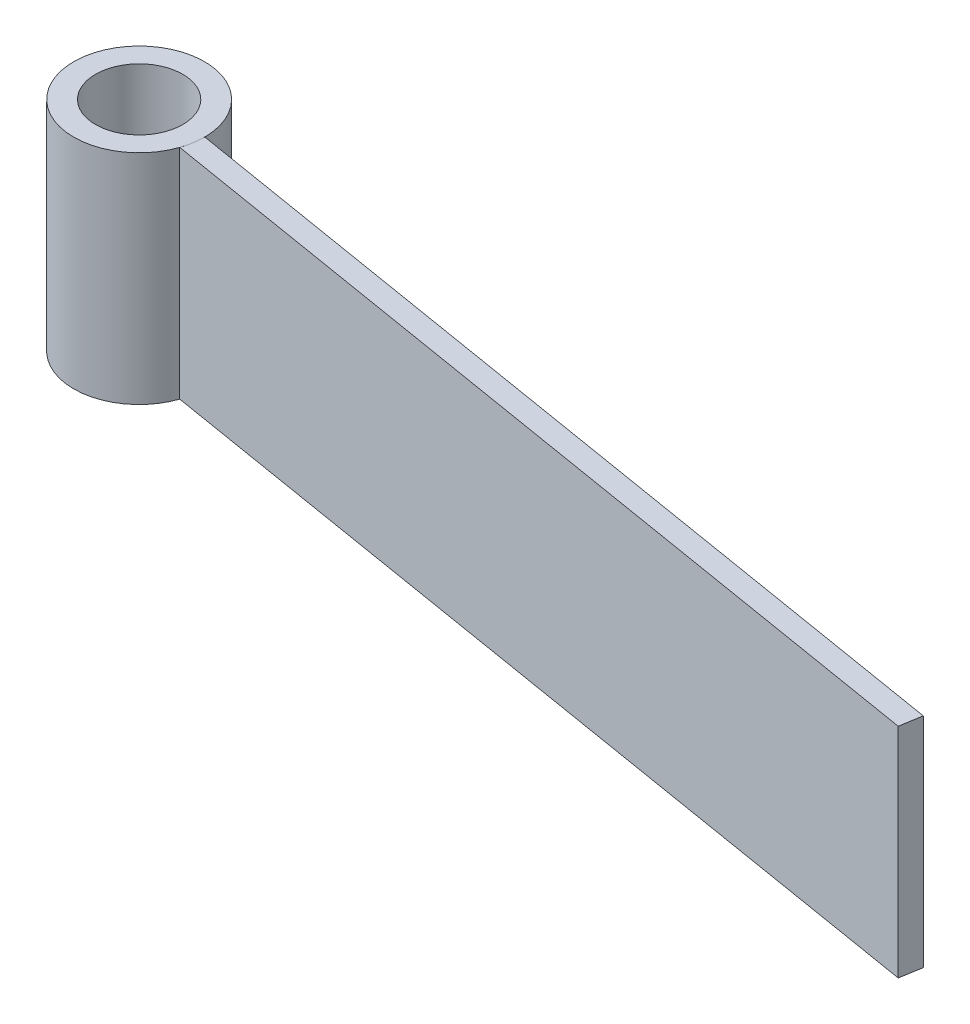
ISO-10303-21;
HEADER;
FILE_DESCRIPTION(('STEP AP214'),'2;1');
FILE_NAME('part.step','',(''),(''),'','','');
FILE_SCHEMA(('AUTOMOTIVE_DESIGN { 1 0 10303 214 1 1 1 1 }'));
ENDSEC;
DATA;
#1=APPLICATION_CONTEXT('core data for automotive mechanical design processes');
#2=APPLICATION_PROTOCOL_DEFINITION('international standard','automotive_design',2000,#1);
#3=PRODUCT_CONTEXT('',#1,'mechanical');
#4=PRODUCT('Part','Part','',(#3));
#5=PRODUCT_RELATED_PRODUCT_CATEGORY('part','',(#4));
#6=PRODUCT_DEFINITION_FORMATION('','',#4);
#7=PRODUCT_DEFINITION_CONTEXT('part definition',#1,'design');
#8=PRODUCT_DEFINITION('design','',#6,#7);
#9=PRODUCT_DEFINITION_SHAPE('','',#8);
#10=(LENGTH_UNIT() NAMED_UNIT(*) SI_UNIT(.MILLI.,.METRE.));
#11=(NAMED_UNIT(*) PLANE_ANGLE_UNIT() SI_UNIT($,.RADIAN.));
#12=(NAMED_UNIT(*) SI_UNIT($,.STERADIAN.) SOLID_ANGLE_UNIT());
#13=UNCERTAINTY_MEASURE_WITH_UNIT(LENGTH_MEASURE(1.E-05),#10,'distance_accuracy_value','');
#14=(GEOMETRIC_REPRESENTATION_CONTEXT(3) GLOBAL_UNCERTAINTY_ASSIGNED_CONTEXT((#13)) GLOBAL_UNIT_ASSIGNED_CONTEXT((#10,
#11,#12)) REPRESENTATION_CONTEXT('',''));
#15=CARTESIAN_POINT('',(0.,0.,0.));
#16=DIRECTION('',(0.,0.,1.));
#17=DIRECTION('',(1.,0.,0.));
#18=AXIS2_PLACEMENT_3D('',#15,#16,#17);
#19=CARTESIAN_POINT('',(1.32442718820284,14.8014776365235,14.6259383379182));
#20=DIRECTION('',(0.,-1.,0.));
#21=DIRECTION('',(0.,0.,-1.));
#22=AXIS2_PLACEMENT_3D('',#19,#20,#21);
#23=CYLINDRICAL_SURFACE('',#22,3.81);
#24=CARTESIAN_POINT('',(1.32442718820284,14.8014776365235,14.6259383379182));
#25=DIRECTION('',(0.,1.,0.));
#26=DIRECTION('',(0.,0.,1.));
#27=AXIS2_PLACEMENT_3D('',#24,#25,#26);
#28=CIRCLE('',#27,3.81);
#29=CARTESIAN_POINT('',(1.32442718820284,14.8014776365235,18.4359383379182));
#30=VERTEX_POINT('',#29);
#31=EDGE_CURVE('P0_E10',#30,#30,#28,.T.);
#32=ORIENTED_EDGE('',*,*,#31,.F.);
#33=EDGE_LOOP('',(#32));
#34=FACE_BOUND('',#33,.T.);
#35=CARTESIAN_POINT('',(1.32442718820284,2.1014776365235,14.6259383379182));
#36=DIRECTION('',(0.,1.,0.));
#37=DIRECTION('',(0.,0.,1.));
#38=AXIS2_PLACEMENT_3D('',#35,#36,#37);
#39=CIRCLE('',#38,3.81);
#40=CARTESIAN_POINT('',(1.32442718820284,2.1014776365235,18.4359383379182));
#41=VERTEX_POINT('',#40);
#42=EDGE_CURVE('P0_E18',#41,#41,#39,.T.);
#43=ORIENTED_EDGE('',*,*,#42,.T.);
#44=EDGE_LOOP('',(#43));
#45=FACE_BOUND('',#44,.T.);
#46=ADVANCED_FACE('P0_F15',(#34,#45),#23,.T.);
#47=CARTESIAN_POINT('',(1.32442718820284,14.8014776365235,14.6259383379182));
#48=DIRECTION('',(0.,1.,0.));
#49=DIRECTION('',(0.,0.,1.));
#50=AXIS2_PLACEMENT_3D('',#47,#48,#49);
#51=PLANE('',#50);
#52=CARTESIAN_POINT('',(1.32442718820284,14.8014776365235,14.6259383379182));
#53=DIRECTION('',(0.,1.,0.));
#54=DIRECTION('',(0.,0.,1.));
#55=AXIS2_PLACEMENT_3D('',#52,#53,#54);
#56=CIRCLE('',#55,2.54);
#57=CARTESIAN_POINT('',(1.32442718820284,14.8014776365235,17.1659383379182));
#58=VERTEX_POINT('',#57);
#59=EDGE_CURVE('P0_E27',#58,#58,#56,.T.);
#60=ORIENTED_EDGE('',*,*,#59,.F.);
#61=EDGE_LOOP('',(#60));
#62=FACE_BOUND('',#61,.T.);
#63=ORIENTED_EDGE('',*,*,#31,.T.);
#64=EDGE_LOOP('',(#63));
#65=FACE_BOUND('',#64,.T.);
#66=ADVANCED_FACE('P0_F42',(#62,#65),#51,.T.);
#67=CARTESIAN_POINT('',(1.32442718820284,2.1014776365235,14.6259383379182));
#68=DIRECTION('',(0.,1.,0.));
#69=DIRECTION('',(0.,0.,1.));
#70=AXIS2_PLACEMENT_3D('',#67,#68,#69);
#71=PLANE('',#70);
#72=CARTESIAN_POINT('',(1.32442718820284,2.1014776365235,14.6259383379182));
#73=DIRECTION('',(0.,1.,0.));
#74=DIRECTION('',(0.,0.,1.));
#75=AXIS2_PLACEMENT_3D('',#72,#73,#74);
#76=CIRCLE('',#75,2.54);
#77=CARTESIAN_POINT('',(1.32442718820284,2.1014776365235,17.1659383379182));
#78=VERTEX_POINT('',#77);
#79=EDGE_CURVE('P0_E25',#78,#78,#76,.T.);
#80=ORIENTED_EDGE('',*,*,#79,.T.);
#81=EDGE_LOOP('',(#80));
#82=FACE_BOUND('',#81,.T.);
#83=ORIENTED_EDGE('',*,*,#42,.F.);
#84=EDGE_LOOP('',(#83));
#85=FACE_BOUND('',#84,.T.);
#86=ADVANCED_FACE('P0_F33',(#82,#85),#71,.F.);
#87=CARTESIAN_POINT('',(1.32442718820284,2.1014776365235,14.6259383379182));
#88=DIRECTION('',(0.,1.,0.));
#89=DIRECTION('',(0.,0.,1.));
#90=AXIS2_PLACEMENT_3D('',#87,#88,#89);
#91=CYLINDRICAL_SURFACE('',#90,2.54);
#92=ORIENTED_EDGE('',*,*,#79,.F.);
#93=EDGE_LOOP('',(#92));
#94=FACE_BOUND('',#93,.T.);
#95=ORIENTED_EDGE('',*,*,#59,.T.);
#96=EDGE_LOOP('',(#95));
#97=FACE_BOUND('',#96,.T.);
#98=ADVANCED_FACE('P0_F36',(#94,#97),#91,.F.);
#99=CLOSED_SHELL('',(#46,#66,#86,#98));
#100=MANIFOLD_SOLID_BREP('P0_B1',#99);
#101=CARTESIAN_POINT('',(5.13439914181266,14.8014776365235,14.6113194216003));
#102=DIRECTION('',(0.,-1.,0.));
#103=DIRECTION('',(-0.162882120661811,0.,0.986645536537166));
#104=AXIS2_PLACEMENT_3D('',#101,#102,#103);
#105=PLANE('',#104);
#106=DIRECTION('',(0.986645536537166,0.,0.162882120661811));
#107=VECTOR('',#106,1.);
#108=CARTESIAN_POINT('',(5.13439914181266,14.8014776365235,14.6113194216003));
#109=LINE('',#108,#107);
#110=CARTESIAN_POINT('',(5.13439914181266,14.8014776365235,14.6113194216003));
#111=VERTEX_POINT('',#110);
#112=CARTESIAN_POINT('',(55.2559923979007,14.8014776365235,22.8857311512203));
#113=VERTEX_POINT('',#112);
#114=EDGE_CURVE('P1_E10',#111,#113,#109,.T.);
#115=ORIENTED_EDGE('',*,*,#114,.F.);
#116=CARTESIAN_POINT('',(1.32442718820386,14.8014776365235,14.6259383379183));
#117=DIRECTION('',(0.,-1.,0.));
#118=DIRECTION('',(-0.162882120661811,0.,0.986645536537166));
#119=AXIS2_PLACEMENT_3D('',#116,#117,#118);
#120=CIRCLE('',#119,3.81);
#121=CARTESIAN_POINT('',(4.92753884857217,14.8014776365235,15.8643592530025));
#122=VERTEX_POINT('',#121);
#123=EDGE_CURVE('P1_E82',#111,#122,#120,.T.);
#124=ORIENTED_EDGE('',*,*,#123,.T.);
#125=DIRECTION('',(0.986645536537166,0.,0.162882120661811));
#126=VECTOR('',#125,1.);
#127=CARTESIAN_POINT('',(4.92753884857216,14.8014776365235,15.8643592530025));
#128=LINE('',#127,#126);
#129=CARTESIAN_POINT('',(55.0491321046602,14.8014776365235,24.1387709826225));
#130=VERTEX_POINT('',#129);
#131=EDGE_CURVE('P1_E64',#122,#130,#128,.T.);
#132=ORIENTED_EDGE('',*,*,#131,.T.);
#133=DIRECTION('',(0.162882120661811,0.,-0.986645536537166));
#134=VECTOR('',#133,1.);
#135=CARTESIAN_POINT('',(55.2559923979007,14.8014776365235,22.8857311512203));
#136=LINE('',#135,#134);
#137=EDGE_CURVE('P1_E69',#130,#113,#136,.T.);
#138=ORIENTED_EDGE('',*,*,#137,.T.);
#139=EDGE_LOOP('',(#115,#124,#132,#138));
#140=FACE_BOUND('',#139,.T.);
#141=ADVANCED_FACE('P1_F16',(#140),#105,.F.);
#142=CARTESIAN_POINT('',(5.13439914181266,2.10147763652349,14.6113194216003));
#143=DIRECTION('',(-0.162882120661811,0.,0.986645536537166));
#144=DIRECTION('',(0.,1.,0.));
#145=AXIS2_PLACEMENT_3D('',#142,#143,#144);
#146=PLANE('',#145);
#147=DIRECTION('',(0.,-1.,0.));
#148=VECTOR('',#147,1.);
#149=CARTESIAN_POINT('',(55.2559923979007,2.10147763652351,22.8857311512203));
#150=LINE('',#149,#148);
#151=CARTESIAN_POINT('',(55.2559923979007,2.10147763652351,22.8857311512203));
#152=VERTEX_POINT('',#151);
#153=EDGE_CURVE('P1_E57',#113,#152,#150,.T.);
#154=ORIENTED_EDGE('',*,*,#153,.T.);
#155=DIRECTION('',(0.986645536537166,0.,0.162882120661811));
#156=VECTOR('',#155,1.);
#157=CARTESIAN_POINT('',(5.13439914181266,2.10147763652349,14.6113194216003));
#158=LINE('',#157,#156);
#159=CARTESIAN_POINT('',(5.13439914181266,2.10147763652349,14.6113194216003));
#160=VERTEX_POINT('',#159);
#161=EDGE_CURVE('P1_E24',#160,#152,#158,.T.);
#162=ORIENTED_EDGE('',*,*,#161,.F.);
#163=DIRECTION('',(0.,-1.,0.));
#164=VECTOR('',#163,1.);
#165=CARTESIAN_POINT('',(5.13439914181266,2.10147763652349,14.6113194216003));
#166=LINE('',#165,#164);
#167=EDGE_CURVE('P1_E70',#111,#160,#166,.T.);
#168=ORIENTED_EDGE('',*,*,#167,.F.);
#169=ORIENTED_EDGE('',*,*,#114,.T.);
#170=EDGE_LOOP('',(#154,#162,#168,#169));
#171=FACE_BOUND('',#170,.T.);
#172=ADVANCED_FACE('P1_F84',(#171),#146,.F.);
#173=CARTESIAN_POINT('',(5.13439914181266,2.10147763652349,14.6113194216003));
#174=DIRECTION('',(0.,1.,0.));
#175=DIRECTION('',(0.162882120661811,0.,-0.986645536537166));
#176=AXIS2_PLACEMENT_3D('',#173,#174,#175);
#177=PLANE('',#176);
#178=DIRECTION('',(0.986645536537166,0.,0.162882120661811));
#179=VECTOR('',#178,1.);
#180=CARTESIAN_POINT('',(4.92753884857216,2.10147763652349,15.8643592530025));
#181=LINE('',#180,#179);
#182=CARTESIAN_POINT('',(4.92753884857216,2.10147763652349,15.8643592530025));
#183=VERTEX_POINT('',#182);
#184=CARTESIAN_POINT('',(55.0491321046602,2.10147763652351,24.1387709826225));
#185=VERTEX_POINT('',#184);
#186=EDGE_CURVE('P1_E51',#183,#185,#181,.T.);
#187=ORIENTED_EDGE('',*,*,#186,.F.);
#188=CARTESIAN_POINT('',(1.32442718820386,2.10147763652349,14.6259383379183));
#189=DIRECTION('',(0.,-1.,0.));
#190=DIRECTION('',(-0.162882120661811,0.,0.986645536537166));
#191=AXIS2_PLACEMENT_3D('',#188,#189,#190);
#192=CIRCLE('',#191,3.81);
#193=EDGE_CURVE('P1_E31',#160,#183,#192,.T.);
#194=ORIENTED_EDGE('',*,*,#193,.F.);
#195=ORIENTED_EDGE('',*,*,#161,.T.);
#196=DIRECTION('',(-0.162882120661811,0.,0.986645536537166));
#197=VECTOR('',#196,1.);
#198=CARTESIAN_POINT('',(55.2559923979007,2.10147763652351,22.8857311512203));
#199=LINE('',#198,#197);
#200=EDGE_CURVE('P1_E48',#152,#185,#199,.T.);
#201=ORIENTED_EDGE('',*,*,#200,.T.);
#202=EDGE_LOOP('',(#187,#194,#195,#201));
#203=FACE_BOUND('',#202,.T.);
#204=ADVANCED_FACE('P1_F50',(#203),#177,.F.);
#205=CARTESIAN_POINT('',(4.92753884857216,2.10147763652349,15.8643592530025));
#206=DIRECTION('',(0.162882120661811,0.,-0.986645536537166));
#207=DIRECTION('',(0.,-1.,0.));
#208=AXIS2_PLACEMENT_3D('',#205,#206,#207);
#209=PLANE('',#208);
#210=DIRECTION('',(0.,1.,0.));
#211=VECTOR('',#210,1.);
#212=CARTESIAN_POINT('',(55.0491321046602,2.10147763652351,24.1387709826225));
#213=LINE('',#212,#211);
#214=EDGE_CURVE('P1_E56',#185,#130,#213,.T.);
#215=ORIENTED_EDGE('',*,*,#214,.T.);
#216=ORIENTED_EDGE('',*,*,#131,.F.);
#217=DIRECTION('',(0.,1.,0.));
#218=VECTOR('',#217,1.);
#219=CARTESIAN_POINT('',(4.92753884857216,2.10147763652349,15.8643592530025));
#220=LINE('',#219,#218);
#221=EDGE_CURVE('P1_E63',#183,#122,#220,.T.);
#222=ORIENTED_EDGE('',*,*,#221,.F.);
#223=ORIENTED_EDGE('',*,*,#186,.T.);
#224=EDGE_LOOP('',(#215,#216,#222,#223));
#225=FACE_BOUND('',#224,.T.);
#226=ADVANCED_FACE('P1_F60',(#225),#209,.F.);
#227=CARTESIAN_POINT('',(55.1525622512804,8.45147763652352,23.5122510669214));
#228=DIRECTION('',(-0.986645536537166,0.,-0.162882120661811));
#229=DIRECTION('',(0.162882120661811,0.,-0.986645536537166));
#230=AXIS2_PLACEMENT_3D('',#227,#228,#229);
#231=PLANE('',#230);
#232=ORIENTED_EDGE('',*,*,#137,.F.);
#233=ORIENTED_EDGE('',*,*,#214,.F.);
#234=ORIENTED_EDGE('',*,*,#200,.F.);
#235=ORIENTED_EDGE('',*,*,#153,.F.);
#236=EDGE_LOOP('',(#232,#233,#234,#235));
#237=FACE_BOUND('',#236,.T.);
#238=ADVANCED_FACE('P1_F67',(#237),#231,.F.);
#239=CARTESIAN_POINT('',(1.32442718820384,52.9014776365235,14.6259383379183));
#240=DIRECTION('',(0.,-1.,0.));
#241=DIRECTION('',(-0.162882120661811,0.,0.986645536537166));
#242=AXIS2_PLACEMENT_3D('',#239,#240,#241);
#243=CYLINDRICAL_SURFACE('',#242,3.81);
#244=ORIENTED_EDGE('',*,*,#167,.T.);
#245=ORIENTED_EDGE('',*,*,#193,.T.);
#246=ORIENTED_EDGE('',*,*,#221,.T.);
#247=ORIENTED_EDGE('',*,*,#123,.F.);
#248=EDGE_LOOP('',(#244,#245,#246,#247));
#249=FACE_BOUND('',#248,.T.);
#250=ADVANCED_FACE('P1_F102',(#249),#243,.F.);
#251=CLOSED_SHELL('',(#141,#172,#204,#226,#238,#250));
#252=MANIFOLD_SOLID_BREP('P1_B1',#251);
#253=ADVANCED_BREP_SHAPE_REPRESENTATION('',(#18,#100,#252),#14);
#254=SHAPE_DEFINITION_REPRESENTATION(#9,#253);
ENDSEC;
END-ISO-10303-21;
